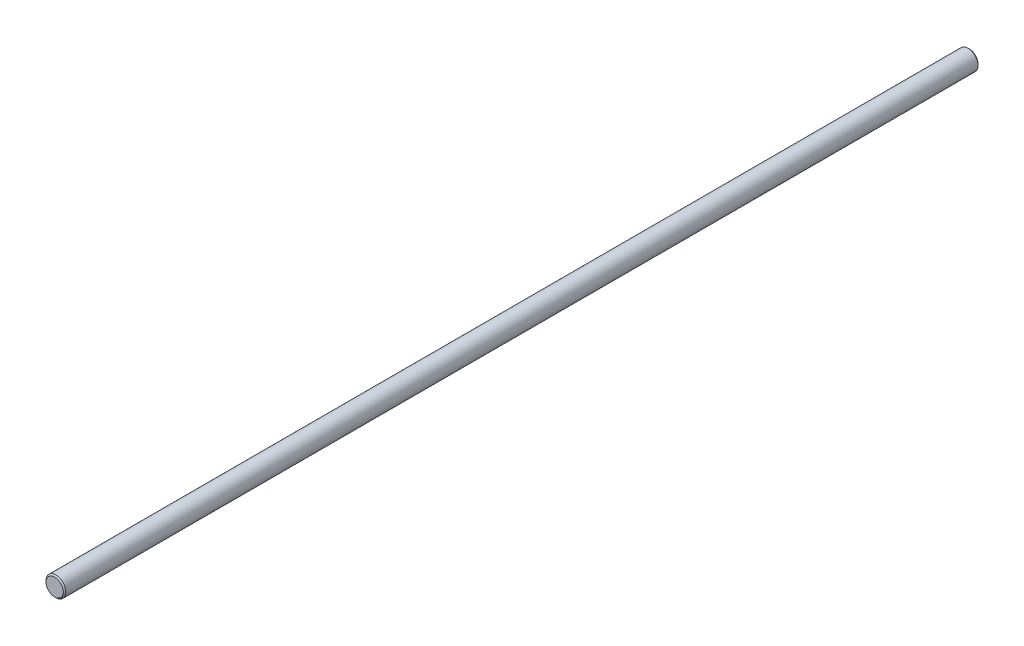
ISO-10303-21;
HEADER;
FILE_DESCRIPTION(('STEP AP214'),'2;1');
FILE_NAME('part.step','',(''),(''),'','','');
FILE_SCHEMA(('AUTOMOTIVE_DESIGN { 1 0 10303 214 1 1 1 1 }'));
ENDSEC;
DATA;
#1=APPLICATION_CONTEXT('core data for automotive mechanical design processes');
#2=APPLICATION_PROTOCOL_DEFINITION('international standard','automotive_design',2000,#1);
#3=PRODUCT_CONTEXT('',#1,'mechanical');
#4=PRODUCT('Part','Part','',(#3));
#5=PRODUCT_RELATED_PRODUCT_CATEGORY('part','',(#4));
#6=PRODUCT_DEFINITION_FORMATION('','',#4);
#7=PRODUCT_DEFINITION_CONTEXT('part definition',#1,'design');
#8=PRODUCT_DEFINITION('design','',#6,#7);
#9=PRODUCT_DEFINITION_SHAPE('','',#8);
#10=(LENGTH_UNIT() NAMED_UNIT(*) SI_UNIT(.MILLI.,.METRE.));
#11=(NAMED_UNIT(*) PLANE_ANGLE_UNIT() SI_UNIT($,.RADIAN.));
#12=(NAMED_UNIT(*) SI_UNIT($,.STERADIAN.) SOLID_ANGLE_UNIT());
#13=UNCERTAINTY_MEASURE_WITH_UNIT(LENGTH_MEASURE(1.E-05),#10,'distance_accuracy_value','');
#14=(GEOMETRIC_REPRESENTATION_CONTEXT(3) GLOBAL_UNCERTAINTY_ASSIGNED_CONTEXT((#13)) GLOBAL_UNIT_ASSIGNED_CONTEXT((#10,
#11,#12)) REPRESENTATION_CONTEXT('',''));
#15=CARTESIAN_POINT('',(0.,0.,0.));
#16=DIRECTION('',(0.,0.,1.));
#17=DIRECTION('',(1.,0.,0.));
#18=AXIS2_PLACEMENT_3D('',#15,#16,#17);
#19=CARTESIAN_POINT('',(0.,0.,369.5));
#20=DIRECTION('',(0.,0.,-1.));
#21=DIRECTION('',(-1.,0.,0.));
#22=AXIS2_PLACEMENT_3D('',#19,#20,#21);
#23=CONICAL_SURFACE('',#22,4.,0.785398163397448);
#24=CARTESIAN_POINT('',(0.,0.,370.));
#25=DIRECTION('',(0.,0.,-1.));
#26=DIRECTION('',(-1.,0.,0.));
#27=AXIS2_PLACEMENT_3D('',#24,#25,#26);
#28=CIRCLE('',#27,3.5);
#29=CARTESIAN_POINT('',(-3.5,0.,370.));
#30=VERTEX_POINT('',#29);
#31=EDGE_CURVE('E43',#30,#30,#28,.T.);
#32=ORIENTED_EDGE('',*,*,#31,.T.);
#33=EDGE_LOOP('',(#32));
#34=FACE_BOUND('',#33,.T.);
#35=CARTESIAN_POINT('',(0.,0.,369.5));
#36=DIRECTION('',(0.,0.,-1.));
#37=DIRECTION('',(-1.,0.,0.));
#38=AXIS2_PLACEMENT_3D('',#35,#36,#37);
#39=CIRCLE('',#38,4.);
#40=CARTESIAN_POINT('',(-4.,0.,369.5));
#41=VERTEX_POINT('',#40);
#42=EDGE_CURVE('E10',#41,#41,#39,.T.);
#43=ORIENTED_EDGE('',*,*,#42,.F.);
#44=EDGE_LOOP('',(#43));
#45=FACE_BOUND('',#44,.T.);
#46=ADVANCED_FACE('F29',(#34,#45),#23,.T.);
#47=CARTESIAN_POINT('',(0.,0.,370.));
#48=DIRECTION('',(0.,0.,-1.));
#49=DIRECTION('',(-1.,0.,0.));
#50=AXIS2_PLACEMENT_3D('',#47,#48,#49);
#51=CYLINDRICAL_SURFACE('',#50,4.);
#52=ORIENTED_EDGE('',*,*,#42,.T.);
#53=EDGE_LOOP('',(#52));
#54=FACE_BOUND('',#53,.T.);
#55=CARTESIAN_POINT('',(0.,0.,0.5));
#56=DIRECTION('',(0.,0.,-1.));
#57=DIRECTION('',(-1.,0.,0.));
#58=AXIS2_PLACEMENT_3D('',#55,#56,#57);
#59=CIRCLE('',#58,4.);
#60=CARTESIAN_POINT('',(-4.,0.,0.5));
#61=VERTEX_POINT('',#60);
#62=EDGE_CURVE('E35',#61,#61,#59,.T.);
#63=ORIENTED_EDGE('',*,*,#62,.F.);
#64=EDGE_LOOP('',(#63));
#65=FACE_BOUND('',#64,.T.);
#66=ADVANCED_FACE('F62',(#54,#65),#51,.T.);
#67=CARTESIAN_POINT('',(0.,0.,0.));
#68=DIRECTION('',(0.,0.,1.));
#69=DIRECTION('',(1.,0.,0.));
#70=AXIS2_PLACEMENT_3D('',#67,#68,#69);
#71=CONICAL_SURFACE('',#70,3.5,0.785398163397447);
#72=ORIENTED_EDGE('',*,*,#62,.T.);
#73=EDGE_LOOP('',(#72));
#74=FACE_BOUND('',#73,.T.);
#75=CARTESIAN_POINT('',(0.,0.,0.));
#76=DIRECTION('',(0.,0.,-1.));
#77=DIRECTION('',(-1.,0.,0.));
#78=AXIS2_PLACEMENT_3D('',#75,#76,#77);
#79=CIRCLE('',#78,3.5);
#80=CARTESIAN_POINT('',(-3.5,0.,0.));
#81=VERTEX_POINT('',#80);
#82=EDGE_CURVE('E39',#81,#81,#79,.T.);
#83=ORIENTED_EDGE('',*,*,#82,.F.);
#84=EDGE_LOOP('',(#83));
#85=FACE_BOUND('',#84,.T.);
#86=ADVANCED_FACE('F58',(#74,#85),#71,.T.);
#87=CARTESIAN_POINT('',(0.,0.,0.));
#88=DIRECTION('',(0.,0.,-1.));
#89=DIRECTION('',(-1.,0.,0.));
#90=AXIS2_PLACEMENT_3D('',#87,#88,#89);
#91=PLANE('',#90);
#92=ORIENTED_EDGE('',*,*,#82,.T.);
#93=EDGE_LOOP('',(#92));
#94=FACE_BOUND('',#93,.T.);
#95=ADVANCED_FACE('F53',(#94),#91,.T.);
#96=CARTESIAN_POINT('',(3.5,0.,370.));
#97=DIRECTION('',(0.,0.,1.));
#98=DIRECTION('',(1.,0.,0.));
#99=AXIS2_PLACEMENT_3D('',#96,#97,#98);
#100=PLANE('',#99);
#101=ORIENTED_EDGE('',*,*,#31,.F.);
#102=EDGE_LOOP('',(#101));
#103=FACE_BOUND('',#102,.T.);
#104=ADVANCED_FACE('F51',(#103),#100,.T.);
#105=CLOSED_SHELL('',(#46,#66,#86,#95,#104));
#106=MANIFOLD_SOLID_BREP('B2',#105);
#107=ADVANCED_BREP_SHAPE_REPRESENTATION('',(#18,#106),#14);
#108=SHAPE_DEFINITION_REPRESENTATION(#9,#107);
ENDSEC;
END-ISO-10303-21;
